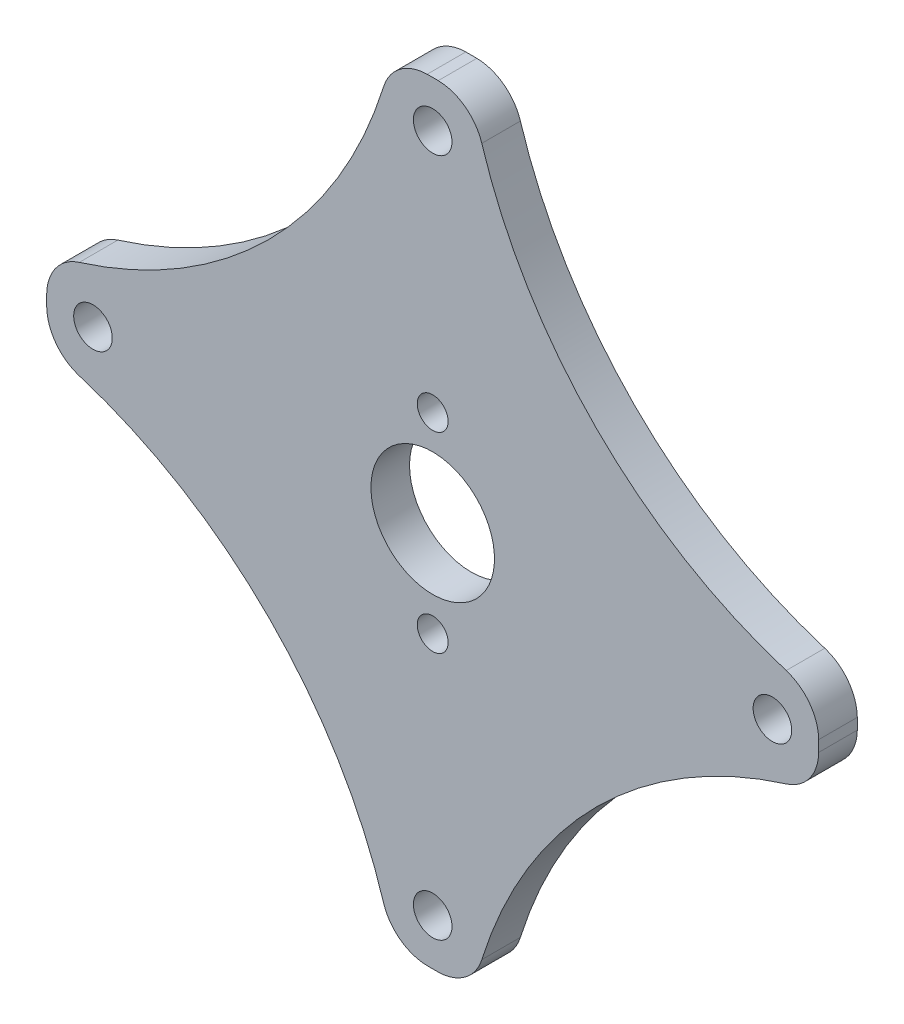
ISO-10303-21;
HEADER;
FILE_DESCRIPTION(('STEP AP214'),'2;1');
FILE_NAME('part.step','',(''),(''),'','','');
FILE_SCHEMA(('AUTOMOTIVE_DESIGN { 1 0 10303 214 1 1 1 1 }'));
ENDSEC;
DATA;
#1=APPLICATION_CONTEXT('core data for automotive mechanical design processes');
#2=APPLICATION_PROTOCOL_DEFINITION('international standard','automotive_design',2000,#1);
#3=PRODUCT_CONTEXT('',#1,'mechanical');
#4=PRODUCT('Part','Part','',(#3));
#5=PRODUCT_RELATED_PRODUCT_CATEGORY('part','',(#4));
#6=PRODUCT_DEFINITION_FORMATION('','',#4);
#7=PRODUCT_DEFINITION_CONTEXT('part definition',#1,'design');
#8=PRODUCT_DEFINITION('design','',#6,#7);
#9=PRODUCT_DEFINITION_SHAPE('','',#8);
#10=(LENGTH_UNIT() NAMED_UNIT(*) SI_UNIT(.MILLI.,.METRE.));
#11=(NAMED_UNIT(*) PLANE_ANGLE_UNIT() SI_UNIT($,.RADIAN.));
#12=(NAMED_UNIT(*) SI_UNIT($,.STERADIAN.) SOLID_ANGLE_UNIT());
#13=UNCERTAINTY_MEASURE_WITH_UNIT(LENGTH_MEASURE(1.E-05),#10,'distance_accuracy_value','');
#14=(GEOMETRIC_REPRESENTATION_CONTEXT(3) GLOBAL_UNCERTAINTY_ASSIGNED_CONTEXT((#13)) GLOBAL_UNIT_ASSIGNED_CONTEXT((#10,
#11,#12)) REPRESENTATION_CONTEXT('',''));
#15=CARTESIAN_POINT('',(0.,0.,0.));
#16=DIRECTION('',(0.,0.,1.));
#17=DIRECTION('',(1.,0.,0.));
#18=AXIS2_PLACEMENT_3D('',#15,#16,#17);
#19=CARTESIAN_POINT('',(0.,0.,2.5));
#20=DIRECTION('',(0.,0.,-1.));
#21=DIRECTION('',(-1.,0.,0.));
#22=AXIS2_PLACEMENT_3D('',#19,#20,#21);
#23=CYLINDRICAL_SURFACE('',#22,25.);
#24=CARTESIAN_POINT('',(0.,0.,2.5));
#25=DIRECTION('',(0.,0.,1.));
#26=DIRECTION('',(1.,0.,0.));
#27=AXIS2_PLACEMENT_3D('',#24,#25,#26);
#28=CIRCLE('',#27,25.);
#29=CARTESIAN_POINT('',(0.358418634758283,24.9974305896079,2.5));
#30=VERTEX_POINT('',#29);
#31=CARTESIAN_POINT('',(-0.358418634758458,24.9974305896079,2.5));
#32=VERTEX_POINT('',#31);
#33=EDGE_CURVE('E177',#30,#32,#28,.T.);
#34=ORIENTED_EDGE('',*,*,#33,.F.);
#35=DIRECTION('',(0.,0.,-1.));
#36=VECTOR('',#35,1.);
#37=CARTESIAN_POINT('',(0.358418634758283,24.9974305896079,2.5));
#38=LINE('',#37,#36);
#39=CARTESIAN_POINT('',(0.358418634758283,24.9974305896079,0.));
#40=VERTEX_POINT('',#39);
#41=EDGE_CURVE('E161',#30,#40,#38,.T.);
#42=ORIENTED_EDGE('',*,*,#41,.T.);
#43=CARTESIAN_POINT('',(0.,0.,0.));
#44=DIRECTION('',(0.,0.,1.));
#45=DIRECTION('',(1.,0.,0.));
#46=AXIS2_PLACEMENT_3D('',#43,#44,#45);
#47=CIRCLE('',#46,25.);
#48=CARTESIAN_POINT('',(-0.358418634758458,24.9974305896079,0.));
#49=VERTEX_POINT('',#48);
#50=EDGE_CURVE('E174',#40,#49,#47,.T.);
#51=ORIENTED_EDGE('',*,*,#50,.T.);
#52=DIRECTION('',(0.,0.,-1.));
#53=VECTOR('',#52,1.);
#54=CARTESIAN_POINT('',(-0.358418634758458,24.9974305896079,2.5));
#55=LINE('',#54,#53);
#56=EDGE_CURVE('E179',#49,#32,#55,.F.);
#57=ORIENTED_EDGE('',*,*,#56,.T.);
#58=EDGE_LOOP('',(#34,#42,#51,#57));
#59=FACE_BOUND('',#58,.T.);
#60=ADVANCED_FACE('F41',(#59),#23,.T.);
#61=CARTESIAN_POINT('',(-24.9974305896079,0.35841863475819,2.5));
#62=VERTEX_POINT('',#61);
#63=CARTESIAN_POINT('',(-24.9974305896079,-0.358418634758549,2.5));
#64=VERTEX_POINT('',#63);
#65=EDGE_CURVE('E326',#62,#64,#28,.T.);
#66=ORIENTED_EDGE('',*,*,#65,.F.);
#67=DIRECTION('',(0.,0.,-1.));
#68=VECTOR('',#67,1.);
#69=CARTESIAN_POINT('',(-24.9974305896079,0.35841863475819,2.5));
#70=LINE('',#69,#68);
#71=CARTESIAN_POINT('',(-24.9974305896079,0.35841863475819,0.));
#72=VERTEX_POINT('',#71);
#73=EDGE_CURVE('E313',#62,#72,#70,.T.);
#74=ORIENTED_EDGE('',*,*,#73,.T.);
#75=CARTESIAN_POINT('',(-24.9974305896079,-0.358418634758549,0.));
#76=VERTEX_POINT('',#75);
#77=EDGE_CURVE('E186',#72,#76,#47,.T.);
#78=ORIENTED_EDGE('',*,*,#77,.T.);
#79=DIRECTION('',(0.,0.,-1.));
#80=VECTOR('',#79,1.);
#81=CARTESIAN_POINT('',(-24.9974305896079,-0.358418634758549,2.5));
#82=LINE('',#81,#80);
#83=EDGE_CURVE('E310',#76,#64,#82,.F.);
#84=ORIENTED_EDGE('',*,*,#83,.T.);
#85=EDGE_LOOP('',(#66,#74,#78,#84));
#86=FACE_BOUND('',#85,.T.);
#87=ADVANCED_FACE('F353',(#86),#23,.T.);
#88=CARTESIAN_POINT('',(-0.358418634758113,-24.9974305896079,2.5));
#89=VERTEX_POINT('',#88);
#90=CARTESIAN_POINT('',(0.358418634758634,-24.9974305896079,2.5));
#91=VERTEX_POINT('',#90);
#92=EDGE_CURVE('E189',#89,#91,#28,.T.);
#93=ORIENTED_EDGE('',*,*,#92,.F.);
#94=DIRECTION('',(0.,0.,-1.));
#95=VECTOR('',#94,1.);
#96=CARTESIAN_POINT('',(-0.358418634758113,-24.9974305896079,2.5));
#97=LINE('',#96,#95);
#98=CARTESIAN_POINT('',(-0.358418634758113,-24.9974305896079,0.));
#99=VERTEX_POINT('',#98);
#100=EDGE_CURVE('E275',#89,#99,#97,.T.);
#101=ORIENTED_EDGE('',*,*,#100,.T.);
#102=CARTESIAN_POINT('',(0.358418634758634,-24.9974305896079,0.));
#103=VERTEX_POINT('',#102);
#104=EDGE_CURVE('E188',#99,#103,#47,.T.);
#105=ORIENTED_EDGE('',*,*,#104,.T.);
#106=DIRECTION('',(0.,0.,-1.));
#107=VECTOR('',#106,1.);
#108=CARTESIAN_POINT('',(0.358418634758634,-24.9974305896079,2.5));
#109=LINE('',#108,#107);
#110=EDGE_CURVE('E278',#103,#91,#109,.F.);
#111=ORIENTED_EDGE('',*,*,#110,.T.);
#112=EDGE_LOOP('',(#93,#101,#105,#111));
#113=FACE_BOUND('',#112,.T.);
#114=ADVANCED_FACE('F321',(#113),#23,.T.);
#115=CARTESIAN_POINT('',(0.,0.,2.5));
#116=DIRECTION('',(0.,0.,1.));
#117=DIRECTION('',(1.,0.,0.));
#118=AXIS2_PLACEMENT_3D('',#115,#116,#117);
#119=PLANE('',#118);
#120=CARTESIAN_POINT('',(31.8198051533947,31.8198051533948,2.5));
#121=DIRECTION('',(0.,0.,1.));
#122=DIRECTION('',(1.,0.,0.));
#123=AXIS2_PLACEMENT_3D('',#120,#121,#122);
#124=CIRCLE('',#123,30.);
#125=CARTESIAN_POINT('',(3.17944446720616,22.8906540310858,2.5));
#126=VERTEX_POINT('',#125);
#127=CARTESIAN_POINT('',(22.8906540310858,3.17944446720623,2.5));
#128=VERTEX_POINT('',#127);
#129=EDGE_CURVE('E250',#126,#128,#124,.T.);
#130=ORIENTED_EDGE('',*,*,#129,.F.);
#131=CARTESIAN_POINT('',(0.315408398587289,21.9977389188549,2.5));
#132=DIRECTION('',(0.,0.,1.));
#133=DIRECTION('',(1.,0.,0.));
#134=AXIS2_PLACEMENT_3D('',#131,#132,#133);
#135=CIRCLE('',#134,3.);
#136=EDGE_CURVE('E304',#126,#30,#135,.T.);
#137=ORIENTED_EDGE('',*,*,#136,.T.);
#138=ORIENTED_EDGE('',*,*,#33,.T.);
#139=CARTESIAN_POINT('',(-0.315408398587443,21.9977389188549,2.5));
#140=DIRECTION('',(0.,0.,1.));
#141=DIRECTION('',(1.,0.,0.));
#142=AXIS2_PLACEMENT_3D('',#139,#140,#141);
#143=CIRCLE('',#142,3.);
#144=CARTESIAN_POINT('',(-3.17944446720631,22.8906540310858,2.5));
#145=VERTEX_POINT('',#144);
#146=EDGE_CURVE('E302',#32,#145,#143,.T.);
#147=ORIENTED_EDGE('',*,*,#146,.T.);
#148=CARTESIAN_POINT('',(-31.8198051533949,31.8198051533946,2.5));
#149=DIRECTION('',(0.,0.,1.));
#150=DIRECTION('',(1.,0.,0.));
#151=AXIS2_PLACEMENT_3D('',#148,#149,#150);
#152=CIRCLE('',#151,30.);
#153=CARTESIAN_POINT('',(-22.8906540310858,3.17944446720607,2.5));
#154=VERTEX_POINT('',#153);
#155=EDGE_CURVE('E235',#154,#145,#152,.T.);
#156=ORIENTED_EDGE('',*,*,#155,.F.);
#157=CARTESIAN_POINT('',(-21.9977389188549,0.315408398587207,2.5));
#158=DIRECTION('',(0.,0.,1.));
#159=DIRECTION('',(1.,0.,0.));
#160=AXIS2_PLACEMENT_3D('',#157,#158,#159);
#161=CIRCLE('',#160,3.);
#162=EDGE_CURVE('E300',#154,#62,#161,.T.);
#163=ORIENTED_EDGE('',*,*,#162,.T.);
#164=ORIENTED_EDGE('',*,*,#65,.T.);
#165=CARTESIAN_POINT('',(-21.9977389188549,-0.315408398587523,2.5));
#166=DIRECTION('',(0.,0.,1.));
#167=DIRECTION('',(1.,0.,0.));
#168=AXIS2_PLACEMENT_3D('',#165,#166,#167);
#169=CIRCLE('',#168,3.);
#170=CARTESIAN_POINT('',(-22.8906540310858,-3.17944446720639,2.5));
#171=VERTEX_POINT('',#170);
#172=EDGE_CURVE('E298',#64,#171,#169,.T.);
#173=ORIENTED_EDGE('',*,*,#172,.T.);
#174=CARTESIAN_POINT('',(-31.8198051533945,-31.819805153395,2.5));
#175=DIRECTION('',(0.,0.,1.));
#176=DIRECTION('',(1.,0.,0.));
#177=AXIS2_PLACEMENT_3D('',#174,#175,#176);
#178=CIRCLE('',#177,30.);
#179=CARTESIAN_POINT('',(-3.17944446720599,-22.8906540310858,2.5));
#180=VERTEX_POINT('',#179);
#181=EDGE_CURVE('E244',#180,#171,#178,.T.);
#182=ORIENTED_EDGE('',*,*,#181,.F.);
#183=CARTESIAN_POINT('',(-0.31540839858714,-21.9977389188549,2.5));
#184=DIRECTION('',(0.,0.,1.));
#185=DIRECTION('',(1.,0.,0.));
#186=AXIS2_PLACEMENT_3D('',#183,#184,#185);
#187=CIRCLE('',#186,3.);
#188=EDGE_CURVE('E296',#180,#89,#187,.T.);
#189=ORIENTED_EDGE('',*,*,#188,.T.);
#190=ORIENTED_EDGE('',*,*,#92,.T.);
#191=CARTESIAN_POINT('',(0.315408398587598,-21.9977389188549,2.5));
#192=DIRECTION('',(0.,0.,1.));
#193=DIRECTION('',(1.,0.,0.));
#194=AXIS2_PLACEMENT_3D('',#191,#192,#193);
#195=CIRCLE('',#194,3.);
#196=CARTESIAN_POINT('',(3.17944446720647,-22.8906540310858,2.5));
#197=VERTEX_POINT('',#196);
#198=EDGE_CURVE('E294',#91,#197,#195,.T.);
#199=ORIENTED_EDGE('',*,*,#198,.T.);
#200=CARTESIAN_POINT('',(31.8198051533952,-31.8198051533944,2.5));
#201=DIRECTION('',(0.,0.,1.));
#202=DIRECTION('',(1.,0.,0.));
#203=AXIS2_PLACEMENT_3D('',#200,#201,#202);
#204=CIRCLE('',#203,30.);
#205=CARTESIAN_POINT('',(22.8906540310858,-3.17944446720591,2.5));
#206=VERTEX_POINT('',#205);
#207=EDGE_CURVE('E247',#206,#197,#204,.T.);
#208=ORIENTED_EDGE('',*,*,#207,.F.);
#209=CARTESIAN_POINT('',(21.9977389188549,-0.315408398587055,2.5));
#210=DIRECTION('',(0.,0.,1.));
#211=DIRECTION('',(1.,0.,0.));
#212=AXIS2_PLACEMENT_3D('',#209,#210,#211);
#213=CIRCLE('',#212,3.);
#214=CARTESIAN_POINT('',(24.9974305896079,-0.358418634758017,2.5));
#215=VERTEX_POINT('',#214);
#216=EDGE_CURVE('E64',#206,#215,#213,.T.);
#217=ORIENTED_EDGE('',*,*,#216,.T.);
#218=CARTESIAN_POINT('',(24.9974305896079,0.358418634758365,2.5));
#219=VERTEX_POINT('',#218);
#220=EDGE_CURVE('E185',#215,#219,#28,.T.);
#221=ORIENTED_EDGE('',*,*,#220,.T.);
#222=CARTESIAN_POINT('',(21.9977389188549,0.315408398587362,2.5));
#223=DIRECTION('',(0.,0.,1.));
#224=DIRECTION('',(1.,0.,0.));
#225=AXIS2_PLACEMENT_3D('',#222,#223,#224);
#226=CIRCLE('',#225,3.);
#227=EDGE_CURVE('E56',#219,#128,#226,.T.);
#228=ORIENTED_EDGE('',*,*,#227,.T.);
#229=EDGE_LOOP('',(#130,#137,#138,#147,#156,#163,#164,#173,#182,#189,#190,#199,#208,#217,#221,#228));
#230=FACE_BOUND('',#229,.T.);
#231=CARTESIAN_POINT('',(0.,6.20000000000003,2.5));
#232=DIRECTION('',(0.,0.,-1.));
#233=DIRECTION('',(-1.,0.,0.));
#234=AXIS2_PLACEMENT_3D('',#231,#232,#233);
#235=CIRCLE('',#234,1.);
#236=CARTESIAN_POINT('',(-1.,6.20000000000003,2.5));
#237=VERTEX_POINT('',#236);
#238=EDGE_CURVE('E238',#237,#237,#235,.T.);
#239=ORIENTED_EDGE('',*,*,#238,.T.);
#240=EDGE_LOOP('',(#239));
#241=FACE_BOUND('',#240,.T.);
#242=CARTESIAN_POINT('',(0.,0.,2.5));
#243=DIRECTION('',(0.,0.,-1.));
#244=DIRECTION('',(-1.,0.,0.));
#245=AXIS2_PLACEMENT_3D('',#242,#243,#244);
#246=CIRCLE('',#245,4.);
#247=CARTESIAN_POINT('',(-4.00000000000002,0.,2.5));
#248=VERTEX_POINT('',#247);
#249=EDGE_CURVE('E234',#248,#248,#246,.T.);
#250=ORIENTED_EDGE('',*,*,#249,.T.);
#251=EDGE_LOOP('',(#250));
#252=FACE_BOUND('',#251,.T.);
#253=CARTESIAN_POINT('',(0.,-6.20000000000003,2.5));
#254=DIRECTION('',(0.,0.,-1.));
#255=DIRECTION('',(-1.,0.,0.));
#256=AXIS2_PLACEMENT_3D('',#253,#254,#255);
#257=CIRCLE('',#256,1.);
#258=CARTESIAN_POINT('',(-1.,-6.20000000000003,2.5));
#259=VERTEX_POINT('',#258);
#260=EDGE_CURVE('E231',#259,#259,#257,.T.);
#261=ORIENTED_EDGE('',*,*,#260,.T.);
#262=EDGE_LOOP('',(#261));
#263=FACE_BOUND('',#262,.T.);
#264=CARTESIAN_POINT('',(22.0000000000001,-2.26077837006678E-12,2.5));
#265=DIRECTION('',(0.,0.,1.));
#266=DIRECTION('',(1.,0.,0.));
#267=AXIS2_PLACEMENT_3D('',#264,#265,#266);
#268=CIRCLE('',#267,1.25);
#269=CARTESIAN_POINT('',(23.2500000000001,-2.26077837006678E-12,2.5));
#270=VERTEX_POINT('',#269);
#271=EDGE_CURVE('E216',#270,#270,#268,.T.);
#272=ORIENTED_EDGE('',*,*,#271,.F.);
#273=EDGE_LOOP('',(#272));
#274=FACE_BOUND('',#273,.T.);
#275=CARTESIAN_POINT('',(0.,22.0000000000001,2.5));
#276=DIRECTION('',(0.,0.,1.));
#277=DIRECTION('',(1.,0.,0.));
#278=AXIS2_PLACEMENT_3D('',#275,#276,#277);
#279=CIRCLE('',#278,1.25);
#280=CARTESIAN_POINT('',(1.25000000000001,22.0000000000001,2.5));
#281=VERTEX_POINT('',#280);
#282=EDGE_CURVE('E201',#281,#281,#279,.T.);
#283=ORIENTED_EDGE('',*,*,#282,.F.);
#284=EDGE_LOOP('',(#283));
#285=FACE_BOUND('',#284,.T.);
#286=CARTESIAN_POINT('',(-22.0000000000001,-2.25991100832879E-12,2.5));
#287=DIRECTION('',(0.,0.,1.));
#288=DIRECTION('',(-1.,0.,0.));
#289=AXIS2_PLACEMENT_3D('',#286,#287,#288);
#290=CIRCLE('',#289,1.25);
#291=CARTESIAN_POINT('',(-23.2500000000001,-2.25991100832879E-12,2.5));
#292=VERTEX_POINT('',#291);
#293=EDGE_CURVE('E210',#292,#292,#290,.T.);
#294=ORIENTED_EDGE('',*,*,#293,.F.);
#295=EDGE_LOOP('',(#294));
#296=FACE_BOUND('',#295,.T.);
#297=CARTESIAN_POINT('',(-4.52068937839558E-12,-22.0000000000001,2.5));
#298=DIRECTION('',(0.,0.,1.));
#299=DIRECTION('',(1.,0.,0.));
#300=AXIS2_PLACEMENT_3D('',#297,#298,#299);
#301=CIRCLE('',#300,1.25);
#302=CARTESIAN_POINT('',(1.24999999999549,-22.0000000000001,2.5));
#303=VERTEX_POINT('',#302);
#304=EDGE_CURVE('E222',#303,#303,#301,.T.);
#305=ORIENTED_EDGE('',*,*,#304,.F.);
#306=EDGE_LOOP('',(#305));
#307=FACE_BOUND('',#306,.T.);
#308=ADVANCED_FACE('F284',(#230,#241,#252,#263,#274,#285,#296,#307),#119,.T.);
#309=CARTESIAN_POINT('',(0.,0.,0.));
#310=DIRECTION('',(0.,0.,1.));
#311=DIRECTION('',(1.,0.,0.));
#312=AXIS2_PLACEMENT_3D('',#309,#310,#311);
#313=PLANE('',#312);
#314=CARTESIAN_POINT('',(0.,6.20000000000003,0.));
#315=DIRECTION('',(0.,0.,1.));
#316=DIRECTION('',(1.,0.,0.));
#317=AXIS2_PLACEMENT_3D('',#314,#315,#316);
#318=CIRCLE('',#317,1.);
#319=CARTESIAN_POINT('',(1.,6.20000000000003,0.));
#320=VERTEX_POINT('',#319);
#321=EDGE_CURVE('E228',#320,#320,#318,.T.);
#322=ORIENTED_EDGE('',*,*,#321,.T.);
#323=EDGE_LOOP('',(#322));
#324=FACE_BOUND('',#323,.T.);
#325=CARTESIAN_POINT('',(0.,0.,0.));
#326=DIRECTION('',(0.,0.,1.));
#327=DIRECTION('',(1.,0.,0.));
#328=AXIS2_PLACEMENT_3D('',#325,#326,#327);
#329=CIRCLE('',#328,4.);
#330=CARTESIAN_POINT('',(4.00000000000002,0.,0.));
#331=VERTEX_POINT('',#330);
#332=EDGE_CURVE('E531',#331,#331,#329,.T.);
#333=ORIENTED_EDGE('',*,*,#332,.T.);
#334=EDGE_LOOP('',(#333));
#335=FACE_BOUND('',#334,.T.);
#336=CARTESIAN_POINT('',(0.,-6.20000000000003,0.));
#337=DIRECTION('',(0.,0.,1.));
#338=DIRECTION('',(1.,0.,0.));
#339=AXIS2_PLACEMENT_3D('',#336,#337,#338);
#340=CIRCLE('',#339,1.);
#341=CARTESIAN_POINT('',(1.,-6.20000000000003,0.));
#342=VERTEX_POINT('',#341);
#343=EDGE_CURVE('E241',#342,#342,#340,.T.);
#344=ORIENTED_EDGE('',*,*,#343,.T.);
#345=EDGE_LOOP('',(#344));
#346=FACE_BOUND('',#345,.T.);
#347=ORIENTED_EDGE('',*,*,#50,.F.);
#348=CARTESIAN_POINT('',(0.315408398587289,21.9977389188549,0.));
#349=DIRECTION('',(0.,0.,1.));
#350=DIRECTION('',(1.,0.,0.));
#351=AXIS2_PLACEMENT_3D('',#348,#349,#350);
#352=CIRCLE('',#351,3.);
#353=CARTESIAN_POINT('',(3.17944446720616,22.8906540310858,0.));
#354=VERTEX_POINT('',#353);
#355=EDGE_CURVE('E157',#40,#354,#352,.F.);
#356=ORIENTED_EDGE('',*,*,#355,.T.);
#357=CARTESIAN_POINT('',(31.8198051533947,31.8198051533948,0.));
#358=DIRECTION('',(0.,0.,-1.));
#359=DIRECTION('',(-1.,0.,0.));
#360=AXIS2_PLACEMENT_3D('',#357,#358,#359);
#361=CIRCLE('',#360,30.);
#362=CARTESIAN_POINT('',(22.8906540310858,3.17944446720623,0.));
#363=VERTEX_POINT('',#362);
#364=EDGE_CURVE('E253',#363,#354,#361,.T.);
#365=ORIENTED_EDGE('',*,*,#364,.F.);
#366=CARTESIAN_POINT('',(21.9977389188549,0.315408398587362,0.));
#367=DIRECTION('',(0.,0.,1.));
#368=DIRECTION('',(1.,0.,0.));
#369=AXIS2_PLACEMENT_3D('',#366,#367,#368);
#370=CIRCLE('',#369,3.);
#371=CARTESIAN_POINT('',(24.9974305896079,0.358418634758365,0.));
#372=VERTEX_POINT('',#371);
#373=EDGE_CURVE('E178',#363,#372,#370,.F.);
#374=ORIENTED_EDGE('',*,*,#373,.T.);
#375=CARTESIAN_POINT('',(24.9974305896079,-0.358418634758017,0.));
#376=VERTEX_POINT('',#375);
#377=EDGE_CURVE('E192',#376,#372,#47,.T.);
#378=ORIENTED_EDGE('',*,*,#377,.F.);
#379=CARTESIAN_POINT('',(21.9977389188549,-0.315408398587055,0.));
#380=DIRECTION('',(0.,0.,1.));
#381=DIRECTION('',(1.,0.,0.));
#382=AXIS2_PLACEMENT_3D('',#379,#380,#381);
#383=CIRCLE('',#382,3.);
#384=CARTESIAN_POINT('',(22.8906540310858,-3.17944446720591,0.));
#385=VERTEX_POINT('',#384);
#386=EDGE_CURVE('E274',#376,#385,#383,.F.);
#387=ORIENTED_EDGE('',*,*,#386,.T.);
#388=CARTESIAN_POINT('',(31.8198051533952,-31.8198051533944,0.));
#389=DIRECTION('',(0.,0.,-1.));
#390=DIRECTION('',(-1.,0.,0.));
#391=AXIS2_PLACEMENT_3D('',#388,#389,#390);
#392=CIRCLE('',#391,30.);
#393=CARTESIAN_POINT('',(3.17944446720647,-22.8906540310858,0.));
#394=VERTEX_POINT('',#393);
#395=EDGE_CURVE('E255',#394,#385,#392,.T.);
#396=ORIENTED_EDGE('',*,*,#395,.F.);
#397=CARTESIAN_POINT('',(0.315408398587598,-21.9977389188549,0.));
#398=DIRECTION('',(0.,0.,1.));
#399=DIRECTION('',(1.,0.,0.));
#400=AXIS2_PLACEMENT_3D('',#397,#398,#399);
#401=CIRCLE('',#400,3.);
#402=EDGE_CURVE('E335',#394,#103,#401,.F.);
#403=ORIENTED_EDGE('',*,*,#402,.T.);
#404=ORIENTED_EDGE('',*,*,#104,.F.);
#405=CARTESIAN_POINT('',(-0.31540839858714,-21.9977389188549,0.));
#406=DIRECTION('',(0.,0.,1.));
#407=DIRECTION('',(1.,0.,0.));
#408=AXIS2_PLACEMENT_3D('',#405,#406,#407);
#409=CIRCLE('',#408,3.);
#410=CARTESIAN_POINT('',(-3.17944446720599,-22.8906540310858,0.));
#411=VERTEX_POINT('',#410);
#412=EDGE_CURVE('E337',#99,#411,#409,.F.);
#413=ORIENTED_EDGE('',*,*,#412,.T.);
#414=CARTESIAN_POINT('',(-31.8198051533945,-31.819805153395,0.));
#415=DIRECTION('',(0.,0.,-1.));
#416=DIRECTION('',(-1.,0.,0.));
#417=AXIS2_PLACEMENT_3D('',#414,#415,#416);
#418=CIRCLE('',#417,30.);
#419=CARTESIAN_POINT('',(-22.8906540310858,-3.17944446720639,0.));
#420=VERTEX_POINT('',#419);
#421=EDGE_CURVE('E259',#420,#411,#418,.T.);
#422=ORIENTED_EDGE('',*,*,#421,.F.);
#423=CARTESIAN_POINT('',(-21.9977389188549,-0.315408398587523,0.));
#424=DIRECTION('',(0.,0.,1.));
#425=DIRECTION('',(1.,0.,0.));
#426=AXIS2_PLACEMENT_3D('',#423,#424,#425);
#427=CIRCLE('',#426,3.);
#428=EDGE_CURVE('E339',#420,#76,#427,.F.);
#429=ORIENTED_EDGE('',*,*,#428,.T.);
#430=ORIENTED_EDGE('',*,*,#77,.F.);
#431=CARTESIAN_POINT('',(-21.9977389188549,0.315408398587207,0.));
#432=DIRECTION('',(0.,0.,1.));
#433=DIRECTION('',(1.,0.,0.));
#434=AXIS2_PLACEMENT_3D('',#431,#432,#433);
#435=CIRCLE('',#434,3.);
#436=CARTESIAN_POINT('',(-22.8906540310858,3.17944446720607,0.));
#437=VERTEX_POINT('',#436);
#438=EDGE_CURVE('E341',#72,#437,#435,.F.);
#439=ORIENTED_EDGE('',*,*,#438,.T.);
#440=CARTESIAN_POINT('',(-31.8198051533949,31.8198051533946,0.));
#441=DIRECTION('',(0.,0.,-1.));
#442=DIRECTION('',(-1.,0.,0.));
#443=AXIS2_PLACEMENT_3D('',#440,#441,#442);
#444=CIRCLE('',#443,30.);
#445=CARTESIAN_POINT('',(-3.17944446720631,22.8906540310858,0.));
#446=VERTEX_POINT('',#445);
#447=EDGE_CURVE('E256',#446,#437,#444,.T.);
#448=ORIENTED_EDGE('',*,*,#447,.F.);
#449=CARTESIAN_POINT('',(-0.315408398587443,21.9977389188549,0.));
#450=DIRECTION('',(0.,0.,1.));
#451=DIRECTION('',(1.,0.,0.));
#452=AXIS2_PLACEMENT_3D('',#449,#450,#451);
#453=CIRCLE('',#452,3.);
#454=EDGE_CURVE('E168',#446,#49,#453,.F.);
#455=ORIENTED_EDGE('',*,*,#454,.T.);
#456=EDGE_LOOP('',(#347,#356,#365,#374,#378,#387,#396,#403,#404,#413,#422,#429,#430,#439,#448,#455));
#457=FACE_BOUND('',#456,.T.);
#458=CARTESIAN_POINT('',(0.,22.0000000000001,0.));
#459=DIRECTION('',(0.,0.,1.));
#460=DIRECTION('',(1.,0.,0.));
#461=AXIS2_PLACEMENT_3D('',#458,#459,#460);
#462=CIRCLE('',#461,1.25);
#463=CARTESIAN_POINT('',(1.25000000000001,22.0000000000001,0.));
#464=VERTEX_POINT('',#463);
#465=EDGE_CURVE('E205',#464,#464,#462,.T.);
#466=ORIENTED_EDGE('',*,*,#465,.T.);
#467=EDGE_LOOP('',(#466));
#468=FACE_BOUND('',#467,.T.);
#469=CARTESIAN_POINT('',(-22.0000000000001,-2.25991100832879E-12,0.));
#470=DIRECTION('',(0.,0.,1.));
#471=DIRECTION('',(-1.,0.,0.));
#472=AXIS2_PLACEMENT_3D('',#469,#470,#471);
#473=CIRCLE('',#472,1.25);
#474=CARTESIAN_POINT('',(-23.2500000000001,-2.25991100832879E-12,0.));
#475=VERTEX_POINT('',#474);
#476=EDGE_CURVE('E213',#475,#475,#473,.T.);
#477=ORIENTED_EDGE('',*,*,#476,.T.);
#478=EDGE_LOOP('',(#477));
#479=FACE_BOUND('',#478,.T.);
#480=CARTESIAN_POINT('',(22.0000000000001,-2.26077837006678E-12,0.));
#481=DIRECTION('',(0.,0.,1.));
#482=DIRECTION('',(1.,0.,0.));
#483=AXIS2_PLACEMENT_3D('',#480,#481,#482);
#484=CIRCLE('',#483,1.25);
#485=CARTESIAN_POINT('',(23.2500000000001,-2.26077837006678E-12,0.));
#486=VERTEX_POINT('',#485);
#487=EDGE_CURVE('E219',#486,#486,#484,.T.);
#488=ORIENTED_EDGE('',*,*,#487,.T.);
#489=EDGE_LOOP('',(#488));
#490=FACE_BOUND('',#489,.T.);
#491=CARTESIAN_POINT('',(-4.52068937839558E-12,-22.0000000000001,0.));
#492=DIRECTION('',(0.,0.,1.));
#493=DIRECTION('',(1.,0.,0.));
#494=AXIS2_PLACEMENT_3D('',#491,#492,#493);
#495=CIRCLE('',#494,1.25);
#496=CARTESIAN_POINT('',(1.24999999999549,-22.0000000000001,0.));
#497=VERTEX_POINT('',#496);
#498=EDGE_CURVE('E225',#497,#497,#495,.T.);
#499=ORIENTED_EDGE('',*,*,#498,.T.);
#500=EDGE_LOOP('',(#499));
#501=FACE_BOUND('',#500,.T.);
#502=ADVANCED_FACE('F181',(#324,#335,#346,#457,#468,#479,#490,#501),#313,.F.);
#503=ORIENTED_EDGE('',*,*,#220,.F.);
#504=DIRECTION('',(0.,0.,-1.));
#505=VECTOR('',#504,1.);
#506=CARTESIAN_POINT('',(24.9974305896079,-0.358418634758017,2.5));
#507=LINE('',#506,#505);
#508=EDGE_CURVE('E11',#215,#376,#507,.T.);
#509=ORIENTED_EDGE('',*,*,#508,.T.);
#510=ORIENTED_EDGE('',*,*,#377,.T.);
#511=DIRECTION('',(0.,0.,-1.));
#512=VECTOR('',#511,1.);
#513=CARTESIAN_POINT('',(24.9974305896079,0.358418634758365,2.5));
#514=LINE('',#513,#512);
#515=EDGE_CURVE('E49',#372,#219,#514,.F.);
#516=ORIENTED_EDGE('',*,*,#515,.T.);
#517=EDGE_LOOP('',(#503,#509,#510,#516));
#518=FACE_BOUND('',#517,.T.);
#519=ADVANCED_FACE('F281',(#518),#23,.T.);
#520=CARTESIAN_POINT('',(0.,22.0000000000001,2.5));
#521=DIRECTION('',(0.,0.,-1.));
#522=DIRECTION('',(-1.,0.,0.));
#523=AXIS2_PLACEMENT_3D('',#520,#521,#522);
#524=CYLINDRICAL_SURFACE('',#523,1.25);
#525=ORIENTED_EDGE('',*,*,#282,.T.);
#526=EDGE_LOOP('',(#525));
#527=FACE_BOUND('',#526,.T.);
#528=ORIENTED_EDGE('',*,*,#465,.F.);
#529=EDGE_LOOP('',(#528));
#530=FACE_BOUND('',#529,.T.);
#531=ADVANCED_FACE('F384',(#527,#530),#524,.F.);
#532=CARTESIAN_POINT('',(-22.0000000000001,-2.25991100832879E-12,2.5));
#533=DIRECTION('',(0.,0.,-1.));
#534=DIRECTION('',(-1.,0.,0.));
#535=AXIS2_PLACEMENT_3D('',#532,#533,#534);
#536=CYLINDRICAL_SURFACE('',#535,1.25);
#537=ORIENTED_EDGE('',*,*,#293,.T.);
#538=EDGE_LOOP('',(#537));
#539=FACE_BOUND('',#538,.T.);
#540=ORIENTED_EDGE('',*,*,#476,.F.);
#541=EDGE_LOOP('',(#540));
#542=FACE_BOUND('',#541,.T.);
#543=ADVANCED_FACE('F390',(#539,#542),#536,.F.);
#544=CARTESIAN_POINT('',(22.0000000000001,-2.26077837006678E-12,2.5));
#545=DIRECTION('',(0.,0.,-1.));
#546=DIRECTION('',(-1.,0.,0.));
#547=AXIS2_PLACEMENT_3D('',#544,#545,#546);
#548=CYLINDRICAL_SURFACE('',#547,1.25);
#549=ORIENTED_EDGE('',*,*,#271,.T.);
#550=EDGE_LOOP('',(#549));
#551=FACE_BOUND('',#550,.T.);
#552=ORIENTED_EDGE('',*,*,#487,.F.);
#553=EDGE_LOOP('',(#552));
#554=FACE_BOUND('',#553,.T.);
#555=ADVANCED_FACE('F405',(#551,#554),#548,.F.);
#556=CARTESIAN_POINT('',(-4.52068937839558E-12,-22.0000000000001,2.5));
#557=DIRECTION('',(0.,0.,-1.));
#558=DIRECTION('',(-1.,0.,0.));
#559=AXIS2_PLACEMENT_3D('',#556,#557,#558);
#560=CYLINDRICAL_SURFACE('',#559,1.25);
#561=ORIENTED_EDGE('',*,*,#304,.T.);
#562=EDGE_LOOP('',(#561));
#563=FACE_BOUND('',#562,.T.);
#564=ORIENTED_EDGE('',*,*,#498,.F.);
#565=EDGE_LOOP('',(#564));
#566=FACE_BOUND('',#565,.T.);
#567=ADVANCED_FACE('F409',(#563,#566),#560,.F.);
#568=CARTESIAN_POINT('',(0.,-6.20000000000003,2.5));
#569=DIRECTION('',(0.,0.,-1.));
#570=DIRECTION('',(-1.,0.,0.));
#571=AXIS2_PLACEMENT_3D('',#568,#569,#570);
#572=CYLINDRICAL_SURFACE('',#571,1.);
#573=ORIENTED_EDGE('',*,*,#260,.F.);
#574=EDGE_LOOP('',(#573));
#575=FACE_BOUND('',#574,.T.);
#576=ORIENTED_EDGE('',*,*,#343,.F.);
#577=EDGE_LOOP('',(#576));
#578=FACE_BOUND('',#577,.T.);
#579=ADVANCED_FACE('F413',(#575,#578),#572,.F.);
#580=CARTESIAN_POINT('',(0.,0.,2.5));
#581=DIRECTION('',(0.,0.,-1.));
#582=DIRECTION('',(-1.,0.,0.));
#583=AXIS2_PLACEMENT_3D('',#580,#581,#582);
#584=CYLINDRICAL_SURFACE('',#583,4.);
#585=ORIENTED_EDGE('',*,*,#249,.F.);
#586=EDGE_LOOP('',(#585));
#587=FACE_BOUND('',#586,.T.);
#588=ORIENTED_EDGE('',*,*,#332,.F.);
#589=EDGE_LOOP('',(#588));
#590=FACE_BOUND('',#589,.T.);
#591=ADVANCED_FACE('F417',(#587,#590),#584,.F.);
#592=CARTESIAN_POINT('',(0.,6.20000000000003,2.5));
#593=DIRECTION('',(0.,0.,-1.));
#594=DIRECTION('',(-1.,0.,0.));
#595=AXIS2_PLACEMENT_3D('',#592,#593,#594);
#596=CYLINDRICAL_SURFACE('',#595,1.);
#597=ORIENTED_EDGE('',*,*,#238,.F.);
#598=EDGE_LOOP('',(#597));
#599=FACE_BOUND('',#598,.T.);
#600=ORIENTED_EDGE('',*,*,#321,.F.);
#601=EDGE_LOOP('',(#600));
#602=FACE_BOUND('',#601,.T.);
#603=ADVANCED_FACE('F421',(#599,#602),#596,.F.);
#604=CARTESIAN_POINT('',(31.8198051533947,31.8198051533948,10.));
#605=DIRECTION('',(0.,0.,-1.));
#606=DIRECTION('',(-1.,0.,0.));
#607=AXIS2_PLACEMENT_3D('',#604,#605,#606);
#608=CYLINDRICAL_SURFACE('',#607,30.);
#609=ORIENTED_EDGE('',*,*,#364,.T.);
#610=DIRECTION('',(0.,0.,-1.));
#611=VECTOR('',#610,1.);
#612=CARTESIAN_POINT('',(3.17944446720615,22.8906540310858,10.));
#613=LINE('',#612,#611);
#614=EDGE_CURVE('E162',#354,#126,#613,.F.);
#615=ORIENTED_EDGE('',*,*,#614,.T.);
#616=ORIENTED_EDGE('',*,*,#129,.T.);
#617=DIRECTION('',(0.,0.,-1.));
#618=VECTOR('',#617,1.);
#619=CARTESIAN_POINT('',(22.8906540310858,3.17944446720622,10.));
#620=LINE('',#619,#618);
#621=EDGE_CURVE('E167',#128,#363,#620,.T.);
#622=ORIENTED_EDGE('',*,*,#621,.T.);
#623=EDGE_LOOP('',(#609,#615,#616,#622));
#624=FACE_BOUND('',#623,.T.);
#625=ADVANCED_FACE('F288',(#624),#608,.F.);
#626=CARTESIAN_POINT('',(31.8198051533952,-31.8198051533944,10.));
#627=DIRECTION('',(0.,0.,-1.));
#628=DIRECTION('',(-1.,0.,0.));
#629=AXIS2_PLACEMENT_3D('',#626,#627,#628);
#630=CYLINDRICAL_SURFACE('',#629,30.);
#631=ORIENTED_EDGE('',*,*,#207,.T.);
#632=DIRECTION('',(0.,0.,-1.));
#633=VECTOR('',#632,1.);
#634=CARTESIAN_POINT('',(3.17944446720647,-22.8906540310858,10.));
#635=LINE('',#634,#633);
#636=EDGE_CURVE('E269',#197,#394,#635,.T.);
#637=ORIENTED_EDGE('',*,*,#636,.T.);
#638=ORIENTED_EDGE('',*,*,#395,.T.);
#639=DIRECTION('',(0.,0.,-1.));
#640=VECTOR('',#639,1.);
#641=CARTESIAN_POINT('',(22.8906540310858,-3.17944446720591,10.));
#642=LINE('',#641,#640);
#643=EDGE_CURVE('E267',#385,#206,#642,.F.);
#644=ORIENTED_EDGE('',*,*,#643,.T.);
#645=EDGE_LOOP('',(#631,#637,#638,#644));
#646=FACE_BOUND('',#645,.T.);
#647=ADVANCED_FACE('F266',(#646),#630,.F.);
#648=CARTESIAN_POINT('',(-31.8198051533945,-31.819805153395,10.));
#649=DIRECTION('',(0.,0.,-1.));
#650=DIRECTION('',(-1.,0.,0.));
#651=AXIS2_PLACEMENT_3D('',#648,#649,#650);
#652=CYLINDRICAL_SURFACE('',#651,30.);
#653=ORIENTED_EDGE('',*,*,#181,.T.);
#654=DIRECTION('',(0.,0.,-1.));
#655=VECTOR('',#654,1.);
#656=CARTESIAN_POINT('',(-22.8906540310858,-3.17944446720639,10.));
#657=LINE('',#656,#655);
#658=EDGE_CURVE('E318',#171,#420,#657,.T.);
#659=ORIENTED_EDGE('',*,*,#658,.T.);
#660=ORIENTED_EDGE('',*,*,#421,.T.);
#661=DIRECTION('',(0.,0.,-1.));
#662=VECTOR('',#661,1.);
#663=CARTESIAN_POINT('',(-3.17944446720599,-22.8906540310858,10.));
#664=LINE('',#663,#662);
#665=EDGE_CURVE('E316',#411,#180,#664,.F.);
#666=ORIENTED_EDGE('',*,*,#665,.T.);
#667=EDGE_LOOP('',(#653,#659,#660,#666));
#668=FACE_BOUND('',#667,.T.);
#669=ADVANCED_FACE('F360',(#668),#652,.F.);
#670=CARTESIAN_POINT('',(-31.8198051533949,31.8198051533946,10.));
#671=DIRECTION('',(0.,0.,-1.));
#672=DIRECTION('',(-1.,0.,0.));
#673=AXIS2_PLACEMENT_3D('',#670,#671,#672);
#674=CYLINDRICAL_SURFACE('',#673,30.);
#675=ORIENTED_EDGE('',*,*,#155,.T.);
#676=DIRECTION('',(0.,0.,-1.));
#677=VECTOR('',#676,1.);
#678=CARTESIAN_POINT('',(-3.17944446720631,22.8906540310858,10.));
#679=LINE('',#678,#677);
#680=EDGE_CURVE('E308',#145,#446,#679,.T.);
#681=ORIENTED_EDGE('',*,*,#680,.T.);
#682=ORIENTED_EDGE('',*,*,#447,.T.);
#683=DIRECTION('',(0.,0.,-1.));
#684=VECTOR('',#683,1.);
#685=CARTESIAN_POINT('',(-22.8906540310858,3.17944446720607,10.));
#686=LINE('',#685,#684);
#687=EDGE_CURVE('E306',#437,#154,#686,.F.);
#688=ORIENTED_EDGE('',*,*,#687,.T.);
#689=EDGE_LOOP('',(#675,#681,#682,#688));
#690=FACE_BOUND('',#689,.T.);
#691=ADVANCED_FACE('F347',(#690),#674,.F.);
#692=CARTESIAN_POINT('',(0.315408398587289,21.9977389188549,10.));
#693=DIRECTION('',(0.,0.,1.));
#694=DIRECTION('',(1.,0.,0.));
#695=AXIS2_PLACEMENT_3D('',#692,#693,#694);
#696=CYLINDRICAL_SURFACE('',#695,3.);
#697=ORIENTED_EDGE('',*,*,#136,.F.);
#698=ORIENTED_EDGE('',*,*,#614,.F.);
#699=ORIENTED_EDGE('',*,*,#355,.F.);
#700=ORIENTED_EDGE('',*,*,#41,.F.);
#701=EDGE_LOOP('',(#697,#698,#699,#700));
#702=FACE_BOUND('',#701,.T.);
#703=ADVANCED_FACE('F160',(#702),#696,.T.);
#704=CARTESIAN_POINT('',(-0.315408398587443,21.9977389188549,10.));
#705=DIRECTION('',(0.,0.,-1.));
#706=DIRECTION('',(-1.,0.,0.));
#707=AXIS2_PLACEMENT_3D('',#704,#705,#706);
#708=CYLINDRICAL_SURFACE('',#707,3.);
#709=ORIENTED_EDGE('',*,*,#454,.F.);
#710=ORIENTED_EDGE('',*,*,#680,.F.);
#711=ORIENTED_EDGE('',*,*,#146,.F.);
#712=ORIENTED_EDGE('',*,*,#56,.F.);
#713=EDGE_LOOP('',(#709,#710,#711,#712));
#714=FACE_BOUND('',#713,.T.);
#715=ADVANCED_FACE('F452',(#714),#708,.T.);
#716=CARTESIAN_POINT('',(-21.9977389188549,0.315408398587207,10.));
#717=DIRECTION('',(0.,0.,1.));
#718=DIRECTION('',(1.,0.,0.));
#719=AXIS2_PLACEMENT_3D('',#716,#717,#718);
#720=CYLINDRICAL_SURFACE('',#719,3.);
#721=ORIENTED_EDGE('',*,*,#162,.F.);
#722=ORIENTED_EDGE('',*,*,#687,.F.);
#723=ORIENTED_EDGE('',*,*,#438,.F.);
#724=ORIENTED_EDGE('',*,*,#73,.F.);
#725=EDGE_LOOP('',(#721,#722,#723,#724));
#726=FACE_BOUND('',#725,.T.);
#727=ADVANCED_FACE('F351',(#726),#720,.T.);
#728=CARTESIAN_POINT('',(-21.9977389188549,-0.315408398587523,10.));
#729=DIRECTION('',(0.,0.,-1.));
#730=DIRECTION('',(-1.,0.,0.));
#731=AXIS2_PLACEMENT_3D('',#728,#729,#730);
#732=CYLINDRICAL_SURFACE('',#731,3.);
#733=ORIENTED_EDGE('',*,*,#428,.F.);
#734=ORIENTED_EDGE('',*,*,#658,.F.);
#735=ORIENTED_EDGE('',*,*,#172,.F.);
#736=ORIENTED_EDGE('',*,*,#83,.F.);
#737=EDGE_LOOP('',(#733,#734,#735,#736));
#738=FACE_BOUND('',#737,.T.);
#739=ADVANCED_FACE('F357',(#738),#732,.T.);
#740=CARTESIAN_POINT('',(-0.31540839858714,-21.9977389188549,10.));
#741=DIRECTION('',(0.,0.,1.));
#742=DIRECTION('',(1.,0.,0.));
#743=AXIS2_PLACEMENT_3D('',#740,#741,#742);
#744=CYLINDRICAL_SURFACE('',#743,3.);
#745=ORIENTED_EDGE('',*,*,#188,.F.);
#746=ORIENTED_EDGE('',*,*,#665,.F.);
#747=ORIENTED_EDGE('',*,*,#412,.F.);
#748=ORIENTED_EDGE('',*,*,#100,.F.);
#749=EDGE_LOOP('',(#745,#746,#747,#748));
#750=FACE_BOUND('',#749,.T.);
#751=ADVANCED_FACE('F364',(#750),#744,.T.);
#752=CARTESIAN_POINT('',(0.315408398587598,-21.9977389188549,10.));
#753=DIRECTION('',(0.,0.,-1.));
#754=DIRECTION('',(-1.,0.,0.));
#755=AXIS2_PLACEMENT_3D('',#752,#753,#754);
#756=CYLINDRICAL_SURFACE('',#755,3.);
#757=ORIENTED_EDGE('',*,*,#402,.F.);
#758=ORIENTED_EDGE('',*,*,#636,.F.);
#759=ORIENTED_EDGE('',*,*,#198,.F.);
#760=ORIENTED_EDGE('',*,*,#110,.F.);
#761=EDGE_LOOP('',(#757,#758,#759,#760));
#762=FACE_BOUND('',#761,.T.);
#763=ADVANCED_FACE('F365',(#762),#756,.T.);
#764=CARTESIAN_POINT('',(21.9977389188549,-0.315408398587055,10.));
#765=DIRECTION('',(0.,0.,1.));
#766=DIRECTION('',(1.,0.,0.));
#767=AXIS2_PLACEMENT_3D('',#764,#765,#766);
#768=CYLINDRICAL_SURFACE('',#767,3.);
#769=ORIENTED_EDGE('',*,*,#216,.F.);
#770=ORIENTED_EDGE('',*,*,#643,.F.);
#771=ORIENTED_EDGE('',*,*,#386,.F.);
#772=ORIENTED_EDGE('',*,*,#508,.F.);
#773=EDGE_LOOP('',(#769,#770,#771,#772));
#774=FACE_BOUND('',#773,.T.);
#775=ADVANCED_FACE('F272',(#774),#768,.T.);
#776=CARTESIAN_POINT('',(21.9977389188549,0.315408398587362,10.));
#777=DIRECTION('',(0.,0.,-1.));
#778=DIRECTION('',(-1.,0.,0.));
#779=AXIS2_PLACEMENT_3D('',#776,#777,#778);
#780=CYLINDRICAL_SURFACE('',#779,3.);
#781=ORIENTED_EDGE('',*,*,#373,.F.);
#782=ORIENTED_EDGE('',*,*,#621,.F.);
#783=ORIENTED_EDGE('',*,*,#227,.F.);
#784=ORIENTED_EDGE('',*,*,#515,.F.);
#785=EDGE_LOOP('',(#781,#782,#783,#784));
#786=FACE_BOUND('',#785,.T.);
#787=ADVANCED_FACE('F43',(#786),#780,.T.);
#788=CLOSED_SHELL('',(#60,#87,#114,#308,#502,#519,#531,#543,#555,#567,#579,#591,#603,#625,#647,
#669,#691,#703,#715,#727,#739,#751,#763,#775,#787));
#789=MANIFOLD_SOLID_BREP('B2',#788);
#790=ADVANCED_BREP_SHAPE_REPRESENTATION('',(#18,#789),#14);
#791=SHAPE_DEFINITION_REPRESENTATION(#9,#790);
ENDSEC;
END-ISO-10303-21;
